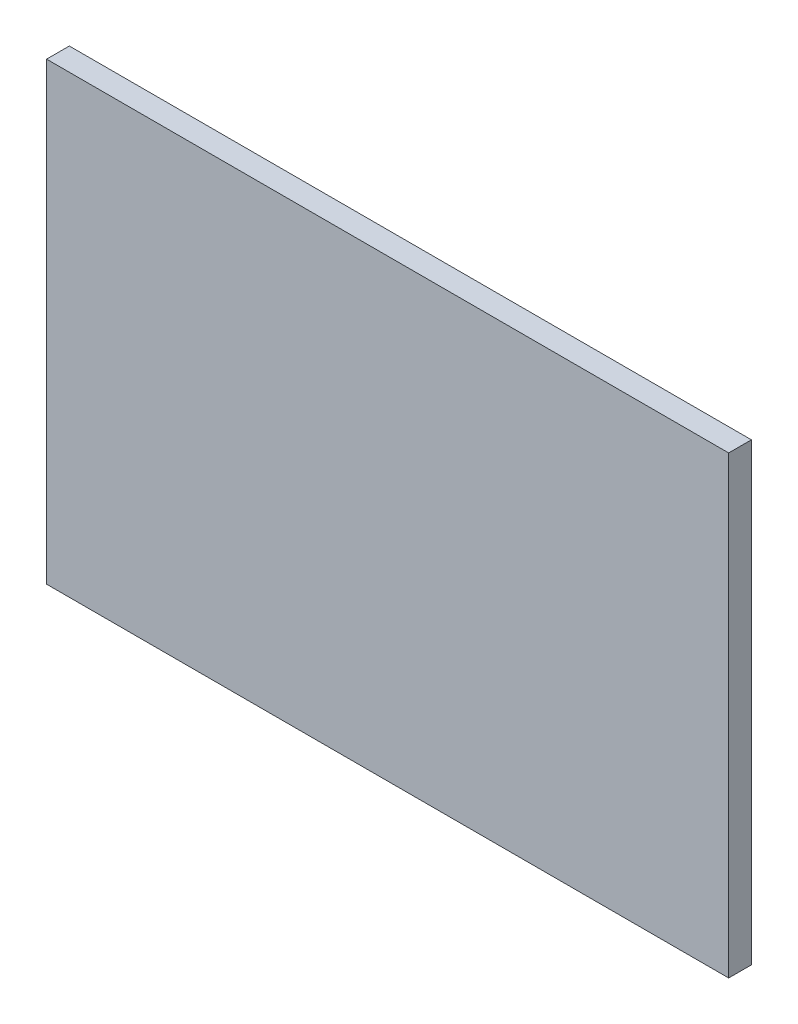
ISO-10303-21;
HEADER;
FILE_DESCRIPTION(('STEP AP214'),'2;1');
FILE_NAME('part.step','',(''),(''),'','','');
FILE_SCHEMA(('AUTOMOTIVE_DESIGN { 1 0 10303 214 1 1 1 1 }'));
ENDSEC;
DATA;
#1=APPLICATION_CONTEXT('core data for automotive mechanical design processes');
#2=APPLICATION_PROTOCOL_DEFINITION('international standard','automotive_design',2000,#1);
#3=PRODUCT_CONTEXT('',#1,'mechanical');
#4=PRODUCT('Part','Part','',(#3));
#5=PRODUCT_RELATED_PRODUCT_CATEGORY('part','',(#4));
#6=PRODUCT_DEFINITION_FORMATION('','',#4);
#7=PRODUCT_DEFINITION_CONTEXT('part definition',#1,'design');
#8=PRODUCT_DEFINITION('design','',#6,#7);
#9=PRODUCT_DEFINITION_SHAPE('','',#8);
#10=(LENGTH_UNIT() NAMED_UNIT(*) SI_UNIT(.MILLI.,.METRE.));
#11=(NAMED_UNIT(*) PLANE_ANGLE_UNIT() SI_UNIT($,.RADIAN.));
#12=(NAMED_UNIT(*) SI_UNIT($,.STERADIAN.) SOLID_ANGLE_UNIT());
#13=UNCERTAINTY_MEASURE_WITH_UNIT(LENGTH_MEASURE(1.E-05),#10,'distance_accuracy_value','');
#14=(GEOMETRIC_REPRESENTATION_CONTEXT(3) GLOBAL_UNCERTAINTY_ASSIGNED_CONTEXT((#13)) GLOBAL_UNIT_ASSIGNED_CONTEXT((#10,
#11,#12)) REPRESENTATION_CONTEXT('',''));
#15=CARTESIAN_POINT('',(0.,0.,0.));
#16=DIRECTION('',(0.,0.,1.));
#17=DIRECTION('',(1.,0.,0.));
#18=AXIS2_PLACEMENT_3D('',#15,#16,#17);
#19=CARTESIAN_POINT('',(0.,0.7,0.5));
#20=DIRECTION('',(0.,0.,1.));
#21=DIRECTION('',(1.,0.,0.));
#22=AXIS2_PLACEMENT_3D('',#19,#20,#21);
#23=PLANE('',#22);
#24=DIRECTION('',(0.,1.,0.));
#25=VECTOR('',#24,1.);
#26=CARTESIAN_POINT('',(-7.5,-4.3,0.5));
#27=LINE('',#26,#25);
#28=CARTESIAN_POINT('',(-7.5,-4.3,0.5));
#29=VERTEX_POINT('',#28);
#30=CARTESIAN_POINT('',(-7.5,5.7,0.5));
#31=VERTEX_POINT('',#30);
#32=EDGE_CURVE('E25',#29,#31,#27,.T.);
#33=ORIENTED_EDGE('',*,*,#32,.F.);
#34=DIRECTION('',(-1.,0.,0.));
#35=VECTOR('',#34,1.);
#36=CARTESIAN_POINT('',(7.5,-4.3,0.5));
#37=LINE('',#36,#35);
#38=CARTESIAN_POINT('',(7.5,-4.3,0.5));
#39=VERTEX_POINT('',#38);
#40=EDGE_CURVE('E70',#39,#29,#37,.T.);
#41=ORIENTED_EDGE('',*,*,#40,.F.);
#42=DIRECTION('',(0.,-1.,0.));
#43=VECTOR('',#42,1.);
#44=CARTESIAN_POINT('',(7.5,5.7,0.5));
#45=LINE('',#44,#43);
#46=CARTESIAN_POINT('',(7.5,5.7,0.5));
#47=VERTEX_POINT('',#46);
#48=EDGE_CURVE('E69',#47,#39,#45,.T.);
#49=ORIENTED_EDGE('',*,*,#48,.F.);
#50=DIRECTION('',(1.,0.,0.));
#51=VECTOR('',#50,1.);
#52=CARTESIAN_POINT('',(-7.5,5.7,0.5));
#53=LINE('',#52,#51);
#54=EDGE_CURVE('E108',#31,#47,#53,.T.);
#55=ORIENTED_EDGE('',*,*,#54,.F.);
#56=EDGE_LOOP('',(#33,#41,#49,#55));
#57=FACE_BOUND('',#56,.T.);
#58=ADVANCED_FACE('F17',(#57),#23,.T.);
#59=CARTESIAN_POINT('',(0.,0.7,0.));
#60=DIRECTION('',(0.,0.,1.));
#61=DIRECTION('',(1.,0.,0.));
#62=AXIS2_PLACEMENT_3D('',#59,#60,#61);
#63=PLANE('',#62);
#64=DIRECTION('',(1.,0.,0.));
#65=VECTOR('',#64,1.);
#66=CARTESIAN_POINT('',(-7.5,5.7,0.));
#67=LINE('',#66,#65);
#68=CARTESIAN_POINT('',(-7.5,5.7,0.));
#69=VERTEX_POINT('',#68);
#70=CARTESIAN_POINT('',(7.5,5.7,0.));
#71=VERTEX_POINT('',#70);
#72=EDGE_CURVE('E93',#69,#71,#67,.T.);
#73=ORIENTED_EDGE('',*,*,#72,.T.);
#74=DIRECTION('',(0.,-1.,0.));
#75=VECTOR('',#74,1.);
#76=CARTESIAN_POINT('',(7.5,5.7,0.));
#77=LINE('',#76,#75);
#78=CARTESIAN_POINT('',(7.5,-4.3,0.));
#79=VERTEX_POINT('',#78);
#80=EDGE_CURVE('E76',#71,#79,#77,.T.);
#81=ORIENTED_EDGE('',*,*,#80,.T.);
#82=DIRECTION('',(-1.,0.,0.));
#83=VECTOR('',#82,1.);
#84=CARTESIAN_POINT('',(7.5,-4.3,0.));
#85=LINE('',#84,#83);
#86=CARTESIAN_POINT('',(-7.5,-4.3,0.));
#87=VERTEX_POINT('',#86);
#88=EDGE_CURVE('E81',#79,#87,#85,.T.);
#89=ORIENTED_EDGE('',*,*,#88,.T.);
#90=DIRECTION('',(0.,1.,0.));
#91=VECTOR('',#90,1.);
#92=CARTESIAN_POINT('',(-7.5,-4.3,0.));
#93=LINE('',#92,#91);
#94=EDGE_CURVE('E11',#87,#69,#93,.T.);
#95=ORIENTED_EDGE('',*,*,#94,.T.);
#96=EDGE_LOOP('',(#73,#81,#89,#95));
#97=FACE_BOUND('',#96,.T.);
#98=ADVANCED_FACE('F158',(#97),#63,.F.);
#99=CARTESIAN_POINT('',(-7.5,-4.3,0.));
#100=DIRECTION('',(-1.,0.,0.));
#101=DIRECTION('',(0.,0.,1.));
#102=AXIS2_PLACEMENT_3D('',#99,#100,#101);
#103=PLANE('',#102);
#104=DIRECTION('',(0.,0.,1.));
#105=VECTOR('',#104,1.);
#106=CARTESIAN_POINT('',(-7.5,-4.3,0.));
#107=LINE('',#106,#105);
#108=EDGE_CURVE('E74',#87,#29,#107,.T.);
#109=ORIENTED_EDGE('',*,*,#108,.T.);
#110=ORIENTED_EDGE('',*,*,#32,.T.);
#111=DIRECTION('',(0.,0.,1.));
#112=VECTOR('',#111,1.);
#113=CARTESIAN_POINT('',(-7.5,5.7,0.));
#114=LINE('',#113,#112);
#115=EDGE_CURVE('E107',#69,#31,#114,.T.);
#116=ORIENTED_EDGE('',*,*,#115,.F.);
#117=ORIENTED_EDGE('',*,*,#94,.F.);
#118=EDGE_LOOP('',(#109,#110,#116,#117));
#119=FACE_BOUND('',#118,.T.);
#120=ADVANCED_FACE('F106',(#119),#103,.T.);
#121=CARTESIAN_POINT('',(7.5,-4.3,0.));
#122=DIRECTION('',(0.,-1.,0.));
#123=DIRECTION('',(0.,0.,-1.));
#124=AXIS2_PLACEMENT_3D('',#121,#122,#123);
#125=PLANE('',#124);
#126=DIRECTION('',(0.,0.,1.));
#127=VECTOR('',#126,1.);
#128=CARTESIAN_POINT('',(7.5,-4.3,0.));
#129=LINE('',#128,#127);
#130=EDGE_CURVE('E78',#79,#39,#129,.T.);
#131=ORIENTED_EDGE('',*,*,#130,.T.);
#132=ORIENTED_EDGE('',*,*,#40,.T.);
#133=ORIENTED_EDGE('',*,*,#108,.F.);
#134=ORIENTED_EDGE('',*,*,#88,.F.);
#135=EDGE_LOOP('',(#131,#132,#133,#134));
#136=FACE_BOUND('',#135,.T.);
#137=ADVANCED_FACE('F79',(#136),#125,.T.);
#138=CARTESIAN_POINT('',(7.5,5.7,0.));
#139=DIRECTION('',(1.,0.,0.));
#140=DIRECTION('',(0.,1.,0.));
#141=AXIS2_PLACEMENT_3D('',#138,#139,#140);
#142=PLANE('',#141);
#143=DIRECTION('',(0.,0.,1.));
#144=VECTOR('',#143,1.);
#145=CARTESIAN_POINT('',(7.5,5.7,0.));
#146=LINE('',#145,#144);
#147=EDGE_CURVE('E86',#71,#47,#146,.T.);
#148=ORIENTED_EDGE('',*,*,#147,.T.);
#149=ORIENTED_EDGE('',*,*,#48,.T.);
#150=ORIENTED_EDGE('',*,*,#130,.F.);
#151=ORIENTED_EDGE('',*,*,#80,.F.);
#152=EDGE_LOOP('',(#148,#149,#150,#151));
#153=FACE_BOUND('',#152,.T.);
#154=ADVANCED_FACE('F88',(#153),#142,.T.);
#155=CARTESIAN_POINT('',(-7.5,5.7,0.));
#156=DIRECTION('',(0.,1.,0.));
#157=DIRECTION('',(1.,0.,0.));
#158=AXIS2_PLACEMENT_3D('',#155,#156,#157);
#159=PLANE('',#158);
#160=ORIENTED_EDGE('',*,*,#115,.T.);
#161=ORIENTED_EDGE('',*,*,#54,.T.);
#162=ORIENTED_EDGE('',*,*,#147,.F.);
#163=ORIENTED_EDGE('',*,*,#72,.F.);
#164=EDGE_LOOP('',(#160,#161,#162,#163));
#165=FACE_BOUND('',#164,.T.);
#166=ADVANCED_FACE('F111',(#165),#159,.T.);
#167=CLOSED_SHELL('',(#58,#98,#120,#137,#154,#166));
#168=MANIFOLD_SOLID_BREP('B1',#167);
#169=ADVANCED_BREP_SHAPE_REPRESENTATION('',(#18,#168),#14);
#170=SHAPE_DEFINITION_REPRESENTATION(#9,#169);
ENDSEC;
END-ISO-10303-21;
